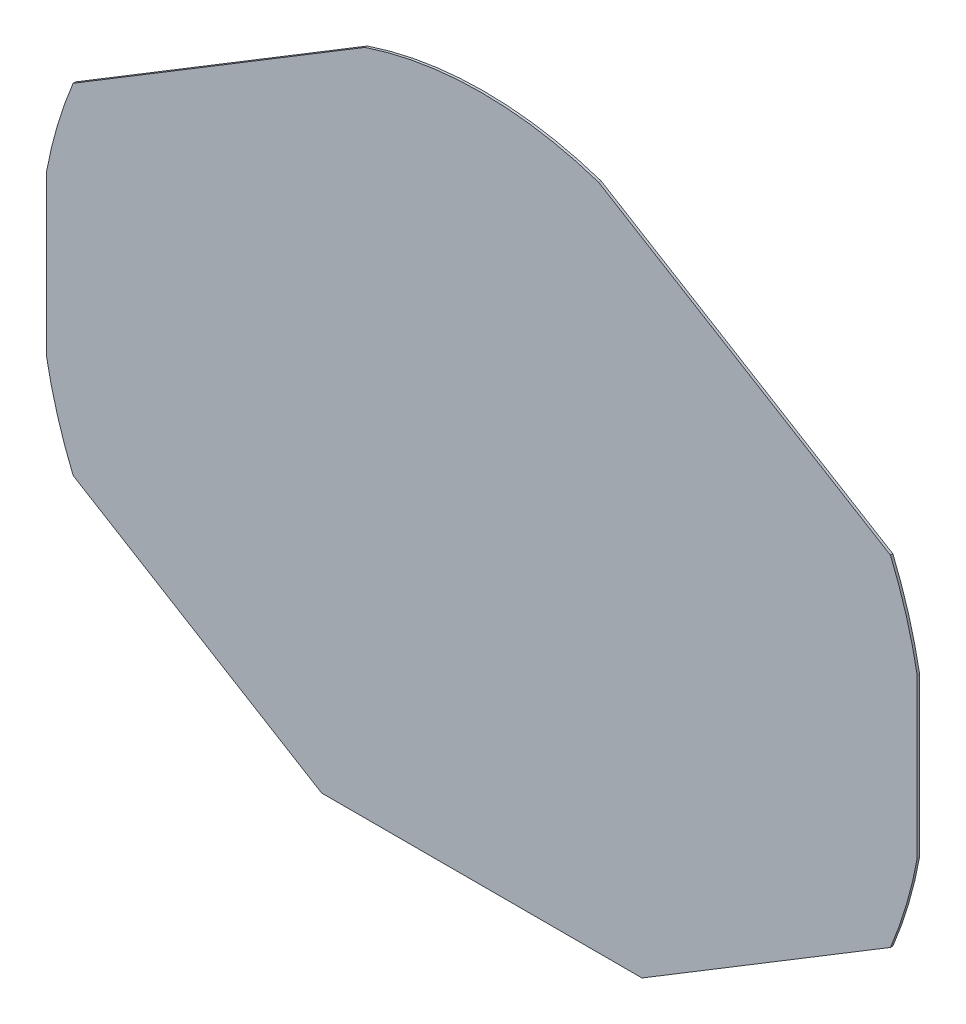
ISO-10303-21;
HEADER;
FILE_DESCRIPTION(('STEP AP214'),'2;1');
FILE_NAME('part.step','',(''),(''),'','','');
FILE_SCHEMA(('AUTOMOTIVE_DESIGN { 1 0 10303 214 1 1 1 1 }'));
ENDSEC;
DATA;
#1=APPLICATION_CONTEXT('core data for automotive mechanical design processes');
#2=APPLICATION_PROTOCOL_DEFINITION('international standard','automotive_design',2000,#1);
#3=PRODUCT_CONTEXT('',#1,'mechanical');
#4=PRODUCT('Part','Part','',(#3));
#5=PRODUCT_RELATED_PRODUCT_CATEGORY('part','',(#4));
#6=PRODUCT_DEFINITION_FORMATION('','',#4);
#7=PRODUCT_DEFINITION_CONTEXT('part definition',#1,'design');
#8=PRODUCT_DEFINITION('design','',#6,#7);
#9=PRODUCT_DEFINITION_SHAPE('','',#8);
#10=(LENGTH_UNIT() NAMED_UNIT(*) SI_UNIT(.MILLI.,.METRE.));
#11=(NAMED_UNIT(*) PLANE_ANGLE_UNIT() SI_UNIT($,.RADIAN.));
#12=(NAMED_UNIT(*) SI_UNIT($,.STERADIAN.) SOLID_ANGLE_UNIT());
#13=UNCERTAINTY_MEASURE_WITH_UNIT(LENGTH_MEASURE(1.E-05),#10,'distance_accuracy_value','');
#14=(GEOMETRIC_REPRESENTATION_CONTEXT(3) GLOBAL_UNCERTAINTY_ASSIGNED_CONTEXT((#13)) GLOBAL_UNIT_ASSIGNED_CONTEXT((#10,
#11,#12)) REPRESENTATION_CONTEXT('',''));
#15=CARTESIAN_POINT('',(0.,0.,0.));
#16=DIRECTION('',(0.,0.,1.));
#17=DIRECTION('',(1.,0.,0.));
#18=AXIS2_PLACEMENT_3D('',#15,#16,#17);
#19=CARTESIAN_POINT('',(0.,0.,0.05));
#20=DIRECTION('',(0.,0.,-1.));
#21=DIRECTION('',(-1.,0.,0.));
#22=AXIS2_PLACEMENT_3D('',#19,#20,#21);
#23=CYLINDRICAL_SURFACE('',#22,9.25);
#24=CARTESIAN_POINT('',(0.,0.,0.));
#25=DIRECTION('',(0.,0.,1.));
#26=DIRECTION('',(1.,0.,0.));
#27=AXIS2_PLACEMENT_3D('',#24,#25,#26);
#28=CIRCLE('',#27,9.25);
#29=CARTESIAN_POINT('',(9.1,1.65906600230372,0.));
#30=VERTEX_POINT('',#29);
#31=CARTESIAN_POINT('',(8.54166260162505,3.55,0.));
#32=VERTEX_POINT('',#31);
#33=EDGE_CURVE('E159',#30,#32,#28,.T.);
#34=ORIENTED_EDGE('',*,*,#33,.T.);
#35=DIRECTION('',(0.,0.,-1.));
#36=VECTOR('',#35,1.);
#37=CARTESIAN_POINT('',(8.54166260162505,3.55,0.05));
#38=LINE('',#37,#36);
#39=CARTESIAN_POINT('',(8.54166260162505,3.55,0.05));
#40=VERTEX_POINT('',#39);
#41=EDGE_CURVE('E11',#40,#32,#38,.T.);
#42=ORIENTED_EDGE('',*,*,#41,.F.);
#43=CARTESIAN_POINT('',(0.,0.,0.05));
#44=DIRECTION('',(0.,0.,1.));
#45=DIRECTION('',(1.,0.,0.));
#46=AXIS2_PLACEMENT_3D('',#43,#44,#45);
#47=CIRCLE('',#46,9.25);
#48=CARTESIAN_POINT('',(9.1,1.65906600230372,0.05));
#49=VERTEX_POINT('',#48);
#50=EDGE_CURVE('E181',#49,#40,#47,.T.);
#51=ORIENTED_EDGE('',*,*,#50,.F.);
#52=DIRECTION('',(0.,0.,-1.));
#53=VECTOR('',#52,1.);
#54=CARTESIAN_POINT('',(9.1,1.65906600230372,0.05));
#55=LINE('',#54,#53);
#56=EDGE_CURVE('E155',#49,#30,#55,.T.);
#57=ORIENTED_EDGE('',*,*,#56,.T.);
#58=EDGE_LOOP('',(#34,#42,#51,#57));
#59=FACE_BOUND('',#58,.T.);
#60=ADVANCED_FACE('F39',(#59),#23,.T.);
#61=CARTESIAN_POINT('',(2.44131112314674,7.25,0.05));
#62=DIRECTION('',(-0.518590479698632,-0.855022756636303,0.));
#63=DIRECTION('',(0.855022756636303,-0.518590479698632,0.));
#64=AXIS2_PLACEMENT_3D('',#61,#62,#63);
#65=PLANE('',#64);
#66=DIRECTION('',(-0.855022756636303,0.518590479698632,0.));
#67=VECTOR('',#66,1.);
#68=CARTESIAN_POINT('',(2.44131112314674,7.25,0.));
#69=LINE('',#68,#67);
#70=CARTESIAN_POINT('',(2.44131112314674,7.25,0.));
#71=VERTEX_POINT('',#70);
#72=EDGE_CURVE('E162',#32,#71,#69,.T.);
#73=ORIENTED_EDGE('',*,*,#72,.T.);
#74=DIRECTION('',(0.,0.,-1.));
#75=VECTOR('',#74,1.);
#76=CARTESIAN_POINT('',(2.44131112314674,7.25,0.05));
#77=LINE('',#76,#75);
#78=CARTESIAN_POINT('',(2.44131112314674,7.25,0.05));
#79=VERTEX_POINT('',#78);
#80=EDGE_CURVE('E50',#79,#71,#77,.T.);
#81=ORIENTED_EDGE('',*,*,#80,.F.);
#82=DIRECTION('',(-0.855022756636303,0.518590479698632,0.));
#83=VECTOR('',#82,1.);
#84=CARTESIAN_POINT('',(2.44131112314674,7.25,0.05));
#85=LINE('',#84,#83);
#86=EDGE_CURVE('E110',#40,#79,#85,.T.);
#87=ORIENTED_EDGE('',*,*,#86,.F.);
#88=ORIENTED_EDGE('',*,*,#41,.T.);
#89=EDGE_LOOP('',(#73,#81,#87,#88));
#90=FACE_BOUND('',#89,.T.);
#91=ADVANCED_FACE('F260',(#90),#65,.F.);
#92=CARTESIAN_POINT('',(0.,0.,0.05));
#93=DIRECTION('',(0.,0.,-1.));
#94=DIRECTION('',(-1.,0.,0.));
#95=AXIS2_PLACEMENT_3D('',#92,#93,#94);
#96=CYLINDRICAL_SURFACE('',#95,7.65);
#97=CARTESIAN_POINT('',(0.,0.,0.));
#98=DIRECTION('',(0.,0.,1.));
#99=DIRECTION('',(1.,0.,0.));
#100=AXIS2_PLACEMENT_3D('',#97,#98,#99);
#101=CIRCLE('',#100,7.65);
#102=CARTESIAN_POINT('',(-2.44131112314674,7.25,0.));
#103=VERTEX_POINT('',#102);
#104=EDGE_CURVE('E163',#71,#103,#101,.T.);
#105=ORIENTED_EDGE('',*,*,#104,.T.);
#106=DIRECTION('',(0.,0.,-1.));
#107=VECTOR('',#106,1.);
#108=CARTESIAN_POINT('',(-2.44131112314674,7.25,0.05));
#109=LINE('',#108,#107);
#110=CARTESIAN_POINT('',(-2.44131112314674,7.25,0.05));
#111=VERTEX_POINT('',#110);
#112=EDGE_CURVE('E200',#111,#103,#109,.T.);
#113=ORIENTED_EDGE('',*,*,#112,.F.);
#114=CARTESIAN_POINT('',(0.,0.,0.05));
#115=DIRECTION('',(0.,0.,1.));
#116=DIRECTION('',(1.,0.,0.));
#117=AXIS2_PLACEMENT_3D('',#114,#115,#116);
#118=CIRCLE('',#117,7.65);
#119=EDGE_CURVE('E209',#79,#111,#118,.T.);
#120=ORIENTED_EDGE('',*,*,#119,.F.);
#121=ORIENTED_EDGE('',*,*,#80,.T.);
#122=EDGE_LOOP('',(#105,#113,#120,#121));
#123=FACE_BOUND('',#122,.T.);
#124=ADVANCED_FACE('F206',(#123),#96,.T.);
#125=CARTESIAN_POINT('',(-2.44131112314674,7.25,0.05));
#126=DIRECTION('',(0.518590479698632,-0.855022756636303,0.));
#127=DIRECTION('',(0.855022756636303,0.518590479698632,0.));
#128=AXIS2_PLACEMENT_3D('',#125,#126,#127);
#129=PLANE('',#128);
#130=DIRECTION('',(-0.855022756636303,-0.518590479698632,0.));
#131=VECTOR('',#130,1.);
#132=CARTESIAN_POINT('',(-2.44131112314674,7.25,0.));
#133=LINE('',#132,#131);
#134=CARTESIAN_POINT('',(-8.54166260162505,3.55,0.));
#135=VERTEX_POINT('',#134);
#136=EDGE_CURVE('E168',#103,#135,#133,.T.);
#137=ORIENTED_EDGE('',*,*,#136,.T.);
#138=DIRECTION('',(0.,0.,-1.));
#139=VECTOR('',#138,1.);
#140=CARTESIAN_POINT('',(-8.54166260162505,3.55,0.05));
#141=LINE('',#140,#139);
#142=CARTESIAN_POINT('',(-8.54166260162505,3.55,0.05));
#143=VERTEX_POINT('',#142);
#144=EDGE_CURVE('E197',#143,#135,#141,.T.);
#145=ORIENTED_EDGE('',*,*,#144,.F.);
#146=DIRECTION('',(-0.855022756636303,-0.518590479698632,0.));
#147=VECTOR('',#146,1.);
#148=CARTESIAN_POINT('',(-2.44131112314674,7.25,0.05));
#149=LINE('',#148,#147);
#150=EDGE_CURVE('E226',#111,#143,#149,.T.);
#151=ORIENTED_EDGE('',*,*,#150,.F.);
#152=ORIENTED_EDGE('',*,*,#112,.T.);
#153=EDGE_LOOP('',(#137,#145,#151,#152));
#154=FACE_BOUND('',#153,.T.);
#155=ADVANCED_FACE('F220',(#154),#129,.F.);
#156=CARTESIAN_POINT('',(0.,0.,0.05));
#157=DIRECTION('',(0.,0.,-1.));
#158=DIRECTION('',(-1.,0.,0.));
#159=AXIS2_PLACEMENT_3D('',#156,#157,#158);
#160=CYLINDRICAL_SURFACE('',#159,9.25);
#161=CARTESIAN_POINT('',(0.,0.,0.));
#162=DIRECTION('',(0.,0.,1.));
#163=DIRECTION('',(-1.,0.,0.));
#164=AXIS2_PLACEMENT_3D('',#161,#162,#163);
#165=CIRCLE('',#164,9.25);
#166=CARTESIAN_POINT('',(-9.1,1.65906600230372,0.));
#167=VERTEX_POINT('',#166);
#168=EDGE_CURVE('E166',#135,#167,#165,.T.);
#169=ORIENTED_EDGE('',*,*,#168,.T.);
#170=DIRECTION('',(0.,0.,-1.));
#171=VECTOR('',#170,1.);
#172=CARTESIAN_POINT('',(-9.1,1.65906600230372,0.05));
#173=LINE('',#172,#171);
#174=CARTESIAN_POINT('',(-9.1,1.65906600230372,0.05));
#175=VERTEX_POINT('',#174);
#176=EDGE_CURVE('E191',#175,#167,#173,.T.);
#177=ORIENTED_EDGE('',*,*,#176,.F.);
#178=CARTESIAN_POINT('',(0.,0.,0.05));
#179=DIRECTION('',(0.,0.,1.));
#180=DIRECTION('',(-1.,0.,0.));
#181=AXIS2_PLACEMENT_3D('',#178,#179,#180);
#182=CIRCLE('',#181,9.25);
#183=EDGE_CURVE('E223',#143,#175,#182,.T.);
#184=ORIENTED_EDGE('',*,*,#183,.F.);
#185=ORIENTED_EDGE('',*,*,#144,.T.);
#186=EDGE_LOOP('',(#169,#177,#184,#185));
#187=FACE_BOUND('',#186,.T.);
#188=ADVANCED_FACE('F221',(#187),#160,.T.);
#189=CARTESIAN_POINT('',(-9.1,1.65906600230372,0.05));
#190=DIRECTION('',(1.,0.,0.));
#191=DIRECTION('',(0.,1.,0.));
#192=AXIS2_PLACEMENT_3D('',#189,#190,#191);
#193=PLANE('',#192);
#194=DIRECTION('',(0.,-1.,0.));
#195=VECTOR('',#194,1.);
#196=CARTESIAN_POINT('',(-9.1,1.65906600230372,0.));
#197=LINE('',#196,#195);
#198=CARTESIAN_POINT('',(-9.1,-1.65906600230372,0.));
#199=VERTEX_POINT('',#198);
#200=EDGE_CURVE('E169',#167,#199,#197,.T.);
#201=ORIENTED_EDGE('',*,*,#200,.T.);
#202=DIRECTION('',(0.,0.,-1.));
#203=VECTOR('',#202,1.);
#204=CARTESIAN_POINT('',(-9.1,-1.65906600230372,0.05));
#205=LINE('',#204,#203);
#206=CARTESIAN_POINT('',(-9.1,-1.65906600230372,0.05));
#207=VERTEX_POINT('',#206);
#208=EDGE_CURVE('E192',#207,#199,#205,.T.);
#209=ORIENTED_EDGE('',*,*,#208,.F.);
#210=DIRECTION('',(0.,-1.,0.));
#211=VECTOR('',#210,1.);
#212=CARTESIAN_POINT('',(-9.1,1.65906600230372,0.05));
#213=LINE('',#212,#211);
#214=EDGE_CURVE('E224',#175,#207,#213,.T.);
#215=ORIENTED_EDGE('',*,*,#214,.F.);
#216=ORIENTED_EDGE('',*,*,#176,.T.);
#217=EDGE_LOOP('',(#201,#209,#215,#216));
#218=FACE_BOUND('',#217,.T.);
#219=ADVANCED_FACE('F275',(#218),#193,.F.);
#220=CARTESIAN_POINT('',(0.,0.,0.05));
#221=DIRECTION('',(0.,0.,-1.));
#222=DIRECTION('',(-1.,0.,0.));
#223=AXIS2_PLACEMENT_3D('',#220,#221,#222);
#224=CYLINDRICAL_SURFACE('',#223,9.25);
#225=CARTESIAN_POINT('',(0.,0.,0.));
#226=DIRECTION('',(0.,0.,1.));
#227=DIRECTION('',(1.,0.,0.));
#228=AXIS2_PLACEMENT_3D('',#225,#226,#227);
#229=CIRCLE('',#228,9.25);
#230=CARTESIAN_POINT('',(-8.54166260162505,-3.55,0.));
#231=VERTEX_POINT('',#230);
#232=EDGE_CURVE('E175',#199,#231,#229,.T.);
#233=ORIENTED_EDGE('',*,*,#232,.T.);
#234=DIRECTION('',(0.,0.,-1.));
#235=VECTOR('',#234,1.);
#236=CARTESIAN_POINT('',(-8.54166260162505,-3.55,0.05));
#237=LINE('',#236,#235);
#238=CARTESIAN_POINT('',(-8.54166260162505,-3.55,0.05));
#239=VERTEX_POINT('',#238);
#240=EDGE_CURVE('E187',#239,#231,#237,.T.);
#241=ORIENTED_EDGE('',*,*,#240,.F.);
#242=CARTESIAN_POINT('',(0.,0.,0.05));
#243=DIRECTION('',(0.,0.,1.));
#244=DIRECTION('',(1.,0.,0.));
#245=AXIS2_PLACEMENT_3D('',#242,#243,#244);
#246=CIRCLE('',#245,9.25);
#247=EDGE_CURVE('E228',#207,#239,#246,.T.);
#248=ORIENTED_EDGE('',*,*,#247,.F.);
#249=ORIENTED_EDGE('',*,*,#208,.T.);
#250=EDGE_LOOP('',(#233,#241,#248,#249));
#251=FACE_BOUND('',#250,.T.);
#252=ADVANCED_FACE('F274',(#251),#224,.T.);
#253=CARTESIAN_POINT('',(-3.34812012670435,-6.7,0.05));
#254=DIRECTION('',(0.518590479698633,0.855022756636303,0.));
#255=DIRECTION('',(-0.855022756636303,0.518590479698633,0.));
#256=AXIS2_PLACEMENT_3D('',#253,#254,#255);
#257=PLANE('',#256);
#258=DIRECTION('',(0.855022756636302,-0.518590479698633,0.));
#259=VECTOR('',#258,1.);
#260=CARTESIAN_POINT('',(-3.34812012670435,-6.7,0.));
#261=LINE('',#260,#259);
#262=CARTESIAN_POINT('',(-3.34812012670435,-6.7,0.));
#263=VERTEX_POINT('',#262);
#264=EDGE_CURVE('E174',#231,#263,#261,.T.);
#265=ORIENTED_EDGE('',*,*,#264,.T.);
#266=DIRECTION('',(0.,0.,-1.));
#267=VECTOR('',#266,1.);
#268=CARTESIAN_POINT('',(-3.34812012670435,-6.7,0.05));
#269=LINE('',#268,#267);
#270=CARTESIAN_POINT('',(-3.34812012670435,-6.7,0.05));
#271=VERTEX_POINT('',#270);
#272=EDGE_CURVE('E184',#271,#263,#269,.T.);
#273=ORIENTED_EDGE('',*,*,#272,.F.);
#274=DIRECTION('',(0.855022756636302,-0.518590479698633,0.));
#275=VECTOR('',#274,1.);
#276=CARTESIAN_POINT('',(-3.34812012670435,-6.7,0.05));
#277=LINE('',#276,#275);
#278=EDGE_CURVE('E233',#239,#271,#277,.T.);
#279=ORIENTED_EDGE('',*,*,#278,.F.);
#280=ORIENTED_EDGE('',*,*,#240,.T.);
#281=EDGE_LOOP('',(#265,#273,#279,#280));
#282=FACE_BOUND('',#281,.T.);
#283=ADVANCED_FACE('F238',(#282),#257,.F.);
#284=CARTESIAN_POINT('',(-3.34812012670435,-6.7,0.05));
#285=DIRECTION('',(0.,1.,0.));
#286=DIRECTION('',(-1.,0.,0.));
#287=AXIS2_PLACEMENT_3D('',#284,#285,#286);
#288=PLANE('',#287);
#289=DIRECTION('',(1.,0.,0.));
#290=VECTOR('',#289,1.);
#291=CARTESIAN_POINT('',(-3.34812012670435,-6.7,0.));
#292=LINE('',#291,#290);
#293=CARTESIAN_POINT('',(3.34812012670435,-6.7,0.));
#294=VERTEX_POINT('',#293);
#295=EDGE_CURVE('E176',#263,#294,#292,.T.);
#296=ORIENTED_EDGE('',*,*,#295,.T.);
#297=DIRECTION('',(0.,0.,-1.));
#298=VECTOR('',#297,1.);
#299=CARTESIAN_POINT('',(3.34812012670435,-6.7,0.05));
#300=LINE('',#299,#298);
#301=CARTESIAN_POINT('',(3.34812012670435,-6.7,0.05));
#302=VERTEX_POINT('',#301);
#303=EDGE_CURVE('E148',#302,#294,#300,.T.);
#304=ORIENTED_EDGE('',*,*,#303,.F.);
#305=DIRECTION('',(1.,0.,0.));
#306=VECTOR('',#305,1.);
#307=CARTESIAN_POINT('',(-3.34812012670435,-6.7,0.05));
#308=LINE('',#307,#306);
#309=EDGE_CURVE('E141',#271,#302,#308,.T.);
#310=ORIENTED_EDGE('',*,*,#309,.F.);
#311=ORIENTED_EDGE('',*,*,#272,.T.);
#312=EDGE_LOOP('',(#296,#304,#310,#311));
#313=FACE_BOUND('',#312,.T.);
#314=ADVANCED_FACE('F243',(#313),#288,.F.);
#315=CARTESIAN_POINT('',(3.34812012670435,-6.7,0.05));
#316=DIRECTION('',(-0.518590479698633,0.855022756636303,0.));
#317=DIRECTION('',(-0.855022756636303,-0.518590479698633,0.));
#318=AXIS2_PLACEMENT_3D('',#315,#316,#317);
#319=PLANE('',#318);
#320=DIRECTION('',(0.855022756636303,0.518590479698633,0.));
#321=VECTOR('',#320,1.);
#322=CARTESIAN_POINT('',(3.34812012670435,-6.7,0.));
#323=LINE('',#322,#321);
#324=CARTESIAN_POINT('',(8.54166260162505,-3.55,0.));
#325=VERTEX_POINT('',#324);
#326=EDGE_CURVE('E146',#294,#325,#323,.T.);
#327=ORIENTED_EDGE('',*,*,#326,.T.);
#328=DIRECTION('',(0.,0.,-1.));
#329=VECTOR('',#328,1.);
#330=CARTESIAN_POINT('',(8.54166260162505,-3.55,0.05));
#331=LINE('',#330,#329);
#332=CARTESIAN_POINT('',(8.54166260162505,-3.55,0.05));
#333=VERTEX_POINT('',#332);
#334=EDGE_CURVE('E147',#333,#325,#331,.T.);
#335=ORIENTED_EDGE('',*,*,#334,.F.);
#336=DIRECTION('',(0.855022756636303,0.518590479698633,0.));
#337=VECTOR('',#336,1.);
#338=CARTESIAN_POINT('',(3.34812012670435,-6.7,0.05));
#339=LINE('',#338,#337);
#340=EDGE_CURVE('E134',#302,#333,#339,.T.);
#341=ORIENTED_EDGE('',*,*,#340,.F.);
#342=ORIENTED_EDGE('',*,*,#303,.T.);
#343=EDGE_LOOP('',(#327,#335,#341,#342));
#344=FACE_BOUND('',#343,.T.);
#345=ADVANCED_FACE('F150',(#344),#319,.F.);
#346=CARTESIAN_POINT('',(0.,0.,0.05));
#347=DIRECTION('',(0.,0.,-1.));
#348=DIRECTION('',(-1.,0.,0.));
#349=AXIS2_PLACEMENT_3D('',#346,#347,#348);
#350=CYLINDRICAL_SURFACE('',#349,9.25);
#351=CARTESIAN_POINT('',(0.,0.,0.));
#352=DIRECTION('',(0.,0.,1.));
#353=DIRECTION('',(-1.,0.,0.));
#354=AXIS2_PLACEMENT_3D('',#351,#352,#353);
#355=CIRCLE('',#354,9.25);
#356=CARTESIAN_POINT('',(9.1,-1.65906600230372,0.));
#357=VERTEX_POINT('',#356);
#358=EDGE_CURVE('E96',#325,#357,#355,.T.);
#359=ORIENTED_EDGE('',*,*,#358,.T.);
#360=DIRECTION('',(0.,0.,-1.));
#361=VECTOR('',#360,1.);
#362=CARTESIAN_POINT('',(9.1,-1.65906600230372,0.05));
#363=LINE('',#362,#361);
#364=CARTESIAN_POINT('',(9.1,-1.65906600230372,0.05));
#365=VERTEX_POINT('',#364);
#366=EDGE_CURVE('E151',#365,#357,#363,.T.);
#367=ORIENTED_EDGE('',*,*,#366,.F.);
#368=CARTESIAN_POINT('',(0.,0.,0.05));
#369=DIRECTION('',(0.,0.,1.));
#370=DIRECTION('',(-1.,0.,0.));
#371=AXIS2_PLACEMENT_3D('',#368,#369,#370);
#372=CIRCLE('',#371,9.25);
#373=EDGE_CURVE('E137',#333,#365,#372,.T.);
#374=ORIENTED_EDGE('',*,*,#373,.F.);
#375=ORIENTED_EDGE('',*,*,#334,.T.);
#376=EDGE_LOOP('',(#359,#367,#374,#375));
#377=FACE_BOUND('',#376,.T.);
#378=ADVANCED_FACE('F154',(#377),#350,.T.);
#379=CARTESIAN_POINT('',(9.1,1.65906600230372,0.05));
#380=DIRECTION('',(-1.,0.,0.));
#381=DIRECTION('',(0.,-1.,0.));
#382=AXIS2_PLACEMENT_3D('',#379,#380,#381);
#383=PLANE('',#382);
#384=DIRECTION('',(0.,1.,0.));
#385=VECTOR('',#384,1.);
#386=CARTESIAN_POINT('',(9.1,1.65906600230372,0.));
#387=LINE('',#386,#385);
#388=EDGE_CURVE('E105',#357,#30,#387,.T.);
#389=ORIENTED_EDGE('',*,*,#388,.T.);
#390=ORIENTED_EDGE('',*,*,#56,.F.);
#391=DIRECTION('',(0.,1.,0.));
#392=VECTOR('',#391,1.);
#393=CARTESIAN_POINT('',(9.1,1.65906600230372,0.05));
#394=LINE('',#393,#392);
#395=EDGE_CURVE('E54',#365,#49,#394,.T.);
#396=ORIENTED_EDGE('',*,*,#395,.F.);
#397=ORIENTED_EDGE('',*,*,#366,.T.);
#398=EDGE_LOOP('',(#389,#390,#396,#397));
#399=FACE_BOUND('',#398,.T.);
#400=ADVANCED_FACE('F246',(#399),#383,.F.);
#401=CARTESIAN_POINT('',(0.,0.,0.05));
#402=DIRECTION('',(0.,0.,1.));
#403=DIRECTION('',(1.,0.,0.));
#404=AXIS2_PLACEMENT_3D('',#401,#402,#403);
#405=PLANE('',#404);
#406=ORIENTED_EDGE('',*,*,#50,.T.);
#407=ORIENTED_EDGE('',*,*,#86,.T.);
#408=ORIENTED_EDGE('',*,*,#119,.T.);
#409=ORIENTED_EDGE('',*,*,#150,.T.);
#410=ORIENTED_EDGE('',*,*,#183,.T.);
#411=ORIENTED_EDGE('',*,*,#214,.T.);
#412=ORIENTED_EDGE('',*,*,#247,.T.);
#413=ORIENTED_EDGE('',*,*,#278,.T.);
#414=ORIENTED_EDGE('',*,*,#309,.T.);
#415=ORIENTED_EDGE('',*,*,#340,.T.);
#416=ORIENTED_EDGE('',*,*,#373,.T.);
#417=ORIENTED_EDGE('',*,*,#395,.T.);
#418=EDGE_LOOP('',(#406,#407,#408,#409,#410,#411,#412,#413,#414,#415,#416,#417));
#419=FACE_BOUND('',#418,.T.);
#420=ADVANCED_FACE('F140',(#419),#405,.T.);
#421=CARTESIAN_POINT('',(0.,0.,0.));
#422=DIRECTION('',(0.,0.,1.));
#423=DIRECTION('',(1.,0.,0.));
#424=AXIS2_PLACEMENT_3D('',#421,#422,#423);
#425=PLANE('',#424);
#426=ORIENTED_EDGE('',*,*,#33,.F.);
#427=ORIENTED_EDGE('',*,*,#388,.F.);
#428=ORIENTED_EDGE('',*,*,#358,.F.);
#429=ORIENTED_EDGE('',*,*,#326,.F.);
#430=ORIENTED_EDGE('',*,*,#295,.F.);
#431=ORIENTED_EDGE('',*,*,#264,.F.);
#432=ORIENTED_EDGE('',*,*,#232,.F.);
#433=ORIENTED_EDGE('',*,*,#200,.F.);
#434=ORIENTED_EDGE('',*,*,#168,.F.);
#435=ORIENTED_EDGE('',*,*,#136,.F.);
#436=ORIENTED_EDGE('',*,*,#104,.F.);
#437=ORIENTED_EDGE('',*,*,#72,.F.);
#438=EDGE_LOOP('',(#426,#427,#428,#429,#430,#431,#432,#433,#434,#435,#436,#437));
#439=FACE_BOUND('',#438,.T.);
#440=ADVANCED_FACE('F212',(#439),#425,.F.);
#441=CLOSED_SHELL('',(#60,#91,#124,#155,#188,#219,#252,#283,#314,#345,#378,#400,#420,#440));
#442=MANIFOLD_SOLID_BREP('B2',#441);
#443=ADVANCED_BREP_SHAPE_REPRESENTATION('',(#18,#442),#14);
#444=SHAPE_DEFINITION_REPRESENTATION(#9,#443);
ENDSEC;
END-ISO-10303-21;
